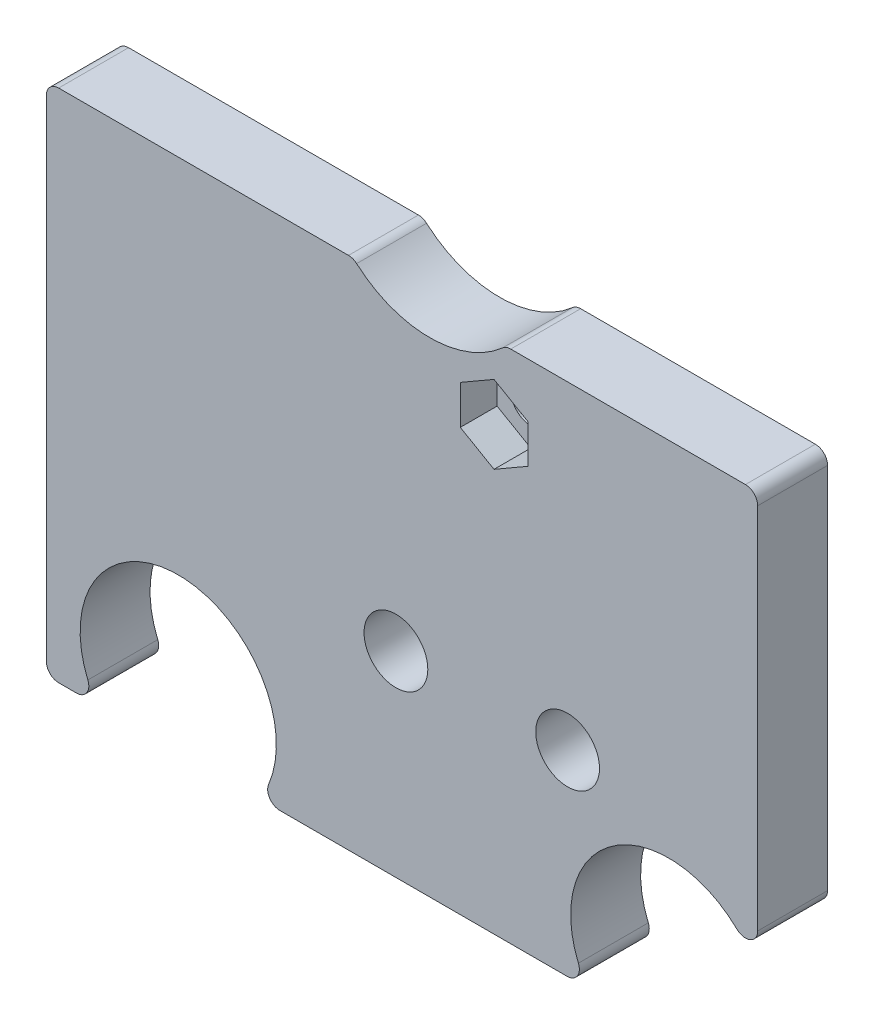
ISO-10303-21;
HEADER;
FILE_DESCRIPTION(('STEP AP214'),'2;1');
FILE_NAME('part.step','',(''),(''),'','','');
FILE_SCHEMA(('AUTOMOTIVE_DESIGN { 1 0 10303 214 1 1 1 1 }'));
ENDSEC;
DATA;
#1=APPLICATION_CONTEXT('core data for automotive mechanical design processes');
#2=APPLICATION_PROTOCOL_DEFINITION('international standard','automotive_design',2000,#1);
#3=PRODUCT_CONTEXT('',#1,'mechanical');
#4=PRODUCT('Part','Part','',(#3));
#5=PRODUCT_RELATED_PRODUCT_CATEGORY('part','',(#4));
#6=PRODUCT_DEFINITION_FORMATION('','',#4);
#7=PRODUCT_DEFINITION_CONTEXT('part definition',#1,'design');
#8=PRODUCT_DEFINITION('design','',#6,#7);
#9=PRODUCT_DEFINITION_SHAPE('','',#8);
#10=(LENGTH_UNIT() NAMED_UNIT(*) SI_UNIT(.MILLI.,.METRE.));
#11=(NAMED_UNIT(*) PLANE_ANGLE_UNIT() SI_UNIT($,.RADIAN.));
#12=(NAMED_UNIT(*) SI_UNIT($,.STERADIAN.) SOLID_ANGLE_UNIT());
#13=UNCERTAINTY_MEASURE_WITH_UNIT(LENGTH_MEASURE(1.E-05),#10,'distance_accuracy_value','');
#14=(GEOMETRIC_REPRESENTATION_CONTEXT(3) GLOBAL_UNCERTAINTY_ASSIGNED_CONTEXT((#13)) GLOBAL_UNIT_ASSIGNED_CONTEXT((#10,
#11,#12)) REPRESENTATION_CONTEXT('',''));
#15=CARTESIAN_POINT('',(0.,0.,0.));
#16=DIRECTION('',(0.,0.,1.));
#17=DIRECTION('',(1.,0.,0.));
#18=AXIS2_PLACEMENT_3D('',#15,#16,#17);
#19=CARTESIAN_POINT('',(26.75,-6.5,5.7));
#20=DIRECTION('',(-1.,0.,0.));
#21=DIRECTION('',(0.,0.,1.));
#22=AXIS2_PLACEMENT_3D('',#19,#20,#21);
#23=PLANE('',#22);
#24=DIRECTION('',(0.,1.,0.));
#25=VECTOR('',#24,1.);
#26=CARTESIAN_POINT('',(26.75,-6.5,0.));
#27=LINE('',#26,#25);
#28=CARTESIAN_POINT('',(26.75,-37.5240830765057,0.));
#29=VERTEX_POINT('',#28);
#30=CARTESIAN_POINT('',(26.75,-7.5,0.));
#31=VERTEX_POINT('',#30);
#32=EDGE_CURVE('E278',#29,#31,#27,.T.);
#33=ORIENTED_EDGE('',*,*,#32,.T.);
#34=DIRECTION('',(0.,0.,-1.));
#35=VECTOR('',#34,1.);
#36=CARTESIAN_POINT('',(26.75,-7.5,5.7));
#37=LINE('',#36,#35);
#38=CARTESIAN_POINT('',(26.75,-7.5,5.7));
#39=VERTEX_POINT('',#38);
#40=EDGE_CURVE('E72',#31,#39,#37,.F.);
#41=ORIENTED_EDGE('',*,*,#40,.T.);
#42=DIRECTION('',(0.,1.,0.));
#43=VECTOR('',#42,1.);
#44=CARTESIAN_POINT('',(26.75,-6.5,5.7));
#45=LINE('',#44,#43);
#46=CARTESIAN_POINT('',(26.75,-37.5240830765057,5.7));
#47=VERTEX_POINT('',#46);
#48=EDGE_CURVE('E343',#47,#39,#45,.T.);
#49=ORIENTED_EDGE('',*,*,#48,.F.);
#50=DIRECTION('',(0.,0.,1.));
#51=VECTOR('',#50,1.);
#52=CARTESIAN_POINT('',(26.75,-37.5240830765057,0.));
#53=LINE('',#52,#51);
#54=EDGE_CURVE('E438',#47,#29,#53,.F.);
#55=ORIENTED_EDGE('',*,*,#54,.T.);
#56=EDGE_LOOP('',(#33,#41,#49,#55));
#57=FACE_BOUND('',#56,.T.);
#58=ADVANCED_FACE('F48',(#57),#23,.F.);
#59=CARTESIAN_POINT('',(-31.25,-6.5,5.7));
#60=DIRECTION('',(0.,-1.,0.));
#61=DIRECTION('',(1.,0.,0.));
#62=AXIS2_PLACEMENT_3D('',#59,#60,#61);
#63=PLANE('',#62);
#64=DIRECTION('',(-1.,0.,0.));
#65=VECTOR('',#64,1.);
#66=CARTESIAN_POINT('',(-31.25,-6.5,5.7));
#67=LINE('',#66,#65);
#68=CARTESIAN_POINT('',(-6.61437827766149,-6.5,5.7));
#69=VERTEX_POINT('',#68);
#70=CARTESIAN_POINT('',(-30.25,-6.5,5.7));
#71=VERTEX_POINT('',#70);
#72=EDGE_CURVE('E312',#69,#71,#67,.T.);
#73=ORIENTED_EDGE('',*,*,#72,.F.);
#74=DIRECTION('',(0.,0.,1.));
#75=VECTOR('',#74,1.);
#76=CARTESIAN_POINT('',(-6.61437827766148,-6.5,0.));
#77=LINE('',#76,#75);
#78=CARTESIAN_POINT('',(-6.61437827766149,-6.5,0.));
#79=VERTEX_POINT('',#78);
#80=EDGE_CURVE('E454',#69,#79,#77,.F.);
#81=ORIENTED_EDGE('',*,*,#80,.T.);
#82=DIRECTION('',(-1.,0.,0.));
#83=VECTOR('',#82,1.);
#84=CARTESIAN_POINT('',(-31.25,-6.5,0.));
#85=LINE('',#84,#83);
#86=CARTESIAN_POINT('',(-30.25,-6.5,0.));
#87=VERTEX_POINT('',#86);
#88=EDGE_CURVE('E302',#79,#87,#85,.T.);
#89=ORIENTED_EDGE('',*,*,#88,.T.);
#90=DIRECTION('',(0.,0.,-1.));
#91=VECTOR('',#90,1.);
#92=CARTESIAN_POINT('',(-30.25,-6.5,5.7));
#93=LINE('',#92,#91);
#94=EDGE_CURVE('E451',#87,#71,#93,.F.);
#95=ORIENTED_EDGE('',*,*,#94,.T.);
#96=EDGE_LOOP('',(#73,#81,#89,#95));
#97=FACE_BOUND('',#96,.T.);
#98=ADVANCED_FACE('F544',(#97),#63,.F.);
#99=CARTESIAN_POINT('',(25.75,-6.5,5.7));
#100=VERTEX_POINT('',#99);
#101=CARTESIAN_POINT('',(6.61437827766147,-6.5,5.7));
#102=VERTEX_POINT('',#101);
#103=EDGE_CURVE('E300',#100,#102,#67,.T.);
#104=ORIENTED_EDGE('',*,*,#103,.F.);
#105=DIRECTION('',(0.,0.,-1.));
#106=VECTOR('',#105,1.);
#107=CARTESIAN_POINT('',(25.75,-6.5,5.7));
#108=LINE('',#107,#106);
#109=CARTESIAN_POINT('',(25.75,-6.5,0.));
#110=VERTEX_POINT('',#109);
#111=EDGE_CURVE('E434',#100,#110,#108,.T.);
#112=ORIENTED_EDGE('',*,*,#111,.T.);
#113=CARTESIAN_POINT('',(6.61437827766147,-6.5,0.));
#114=VERTEX_POINT('',#113);
#115=EDGE_CURVE('E306',#110,#114,#85,.T.);
#116=ORIENTED_EDGE('',*,*,#115,.T.);
#117=DIRECTION('',(0.,0.,1.));
#118=VECTOR('',#117,1.);
#119=CARTESIAN_POINT('',(6.61437827766148,-6.5,5.7));
#120=LINE('',#119,#118);
#121=EDGE_CURVE('E431',#114,#102,#120,.T.);
#122=ORIENTED_EDGE('',*,*,#121,.T.);
#123=EDGE_LOOP('',(#104,#112,#116,#122));
#124=FACE_BOUND('',#123,.T.);
#125=ADVANCED_FACE('F525',(#124),#63,.F.);
#126=CARTESIAN_POINT('',(-31.25,-48.5,5.7));
#127=DIRECTION('',(0.,1.,0.));
#128=DIRECTION('',(0.,0.,1.));
#129=AXIS2_PLACEMENT_3D('',#126,#127,#128);
#130=PLANE('',#129);
#131=DIRECTION('',(1.,0.,0.));
#132=VECTOR('',#131,1.);
#133=CARTESIAN_POINT('',(-31.25,-48.5,0.));
#134=LINE('',#133,#132);
#135=CARTESIAN_POINT('',(-12.2084380241115,-48.5,0.));
#136=VERTEX_POINT('',#135);
#137=CARTESIAN_POINT('',(11.2084380241115,-48.5,0.));
#138=VERTEX_POINT('',#137);
#139=EDGE_CURVE('E355',#136,#138,#134,.T.);
#140=ORIENTED_EDGE('',*,*,#139,.T.);
#141=DIRECTION('',(0.,0.,1.));
#142=VECTOR('',#141,1.);
#143=CARTESIAN_POINT('',(11.2084380241115,-48.5,5.7));
#144=LINE('',#143,#142);
#145=CARTESIAN_POINT('',(11.2084380241115,-48.5,5.7));
#146=VERTEX_POINT('',#145);
#147=EDGE_CURVE('E468',#138,#146,#144,.T.);
#148=ORIENTED_EDGE('',*,*,#147,.T.);
#149=DIRECTION('',(1.,0.,0.));
#150=VECTOR('',#149,1.);
#151=CARTESIAN_POINT('',(-31.25,-48.5,5.7));
#152=LINE('',#151,#150);
#153=CARTESIAN_POINT('',(-12.2084380241115,-48.5,5.7));
#154=VERTEX_POINT('',#153);
#155=EDGE_CURVE('E349',#154,#146,#152,.T.);
#156=ORIENTED_EDGE('',*,*,#155,.F.);
#157=DIRECTION('',(0.,0.,1.));
#158=VECTOR('',#157,1.);
#159=CARTESIAN_POINT('',(-12.2084380241115,-48.5,0.));
#160=LINE('',#159,#158);
#161=EDGE_CURVE('E465',#154,#136,#160,.F.);
#162=ORIENTED_EDGE('',*,*,#161,.T.);
#163=EDGE_LOOP('',(#140,#148,#156,#162));
#164=FACE_BOUND('',#163,.T.);
#165=ADVANCED_FACE('F577',(#164),#130,.F.);
#166=CARTESIAN_POINT('',(-30.25,-48.5,5.7));
#167=VERTEX_POINT('',#166);
#168=CARTESIAN_POINT('',(-28.7915619758885,-48.5,5.7));
#169=VERTEX_POINT('',#168);
#170=EDGE_CURVE('E311',#167,#169,#152,.T.);
#171=ORIENTED_EDGE('',*,*,#170,.F.);
#172=DIRECTION('',(0.,0.,-1.));
#173=VECTOR('',#172,1.);
#174=CARTESIAN_POINT('',(-30.25,-48.5,5.7));
#175=LINE('',#174,#173);
#176=CARTESIAN_POINT('',(-30.25,-48.5,0.));
#177=VERTEX_POINT('',#176);
#178=EDGE_CURVE('E366',#167,#177,#175,.T.);
#179=ORIENTED_EDGE('',*,*,#178,.T.);
#180=CARTESIAN_POINT('',(-28.7915619758885,-48.5,0.));
#181=VERTEX_POINT('',#180);
#182=EDGE_CURVE('E301',#177,#181,#134,.T.);
#183=ORIENTED_EDGE('',*,*,#182,.T.);
#184=DIRECTION('',(0.,0.,1.));
#185=VECTOR('',#184,1.);
#186=CARTESIAN_POINT('',(-28.7915619758885,-48.5,5.7));
#187=LINE('',#186,#185);
#188=EDGE_CURVE('E348',#181,#169,#187,.T.);
#189=ORIENTED_EDGE('',*,*,#188,.T.);
#190=EDGE_LOOP('',(#171,#179,#183,#189));
#191=FACE_BOUND('',#190,.T.);
#192=ADVANCED_FACE('F498',(#191),#130,.F.);
#193=CARTESIAN_POINT('',(-31.25,-6.5,5.7));
#194=DIRECTION('',(1.,0.,0.));
#195=DIRECTION('',(0.,1.,0.));
#196=AXIS2_PLACEMENT_3D('',#193,#194,#195);
#197=PLANE('',#196);
#198=DIRECTION('',(0.,-1.,0.));
#199=VECTOR('',#198,1.);
#200=CARTESIAN_POINT('',(-31.25,-6.5,0.));
#201=LINE('',#200,#199);
#202=CARTESIAN_POINT('',(-31.25,-7.5,0.));
#203=VERTEX_POINT('',#202);
#204=CARTESIAN_POINT('',(-31.25,-47.5,0.));
#205=VERTEX_POINT('',#204);
#206=EDGE_CURVE('E296',#203,#205,#201,.T.);
#207=ORIENTED_EDGE('',*,*,#206,.T.);
#208=DIRECTION('',(0.,0.,-1.));
#209=VECTOR('',#208,1.);
#210=CARTESIAN_POINT('',(-31.25,-47.5,5.7));
#211=LINE('',#210,#209);
#212=CARTESIAN_POINT('',(-31.25,-47.5,5.7));
#213=VERTEX_POINT('',#212);
#214=EDGE_CURVE('E401',#205,#213,#211,.F.);
#215=ORIENTED_EDGE('',*,*,#214,.T.);
#216=DIRECTION('',(0.,-1.,0.));
#217=VECTOR('',#216,1.);
#218=CARTESIAN_POINT('',(-31.25,-6.5,5.7));
#219=LINE('',#218,#217);
#220=CARTESIAN_POINT('',(-31.25,-7.5,5.7));
#221=VERTEX_POINT('',#220);
#222=EDGE_CURVE('E307',#221,#213,#219,.T.);
#223=ORIENTED_EDGE('',*,*,#222,.F.);
#224=DIRECTION('',(0.,0.,-1.));
#225=VECTOR('',#224,1.);
#226=CARTESIAN_POINT('',(-31.25,-7.5,5.7));
#227=LINE('',#226,#225);
#228=EDGE_CURVE('E397',#221,#203,#227,.T.);
#229=ORIENTED_EDGE('',*,*,#228,.T.);
#230=EDGE_LOOP('',(#207,#215,#223,#229));
#231=FACE_BOUND('',#230,.T.);
#232=ADVANCED_FACE('F553',(#231),#197,.F.);
#233=CARTESIAN_POINT('',(0.,0.,5.7));
#234=DIRECTION('',(0.,0.,1.));
#235=DIRECTION('',(1.,0.,0.));
#236=AXIS2_PLACEMENT_3D('',#233,#234,#235);
#237=PLANE('',#236);
#238=DIRECTION('',(0.,-1.,0.));
#239=VECTOR('',#238,1.);
#240=CARTESIAN_POINT('',(2.49999999999967,-10.9122867597282,5.7));
#241=LINE('',#240,#239);
#242=CARTESIAN_POINT('',(2.49999999999967,-10.9122867597282,5.7));
#243=VERTEX_POINT('',#242);
#244=CARTESIAN_POINT('',(2.49999999999967,-14.0877132402712,5.7));
#245=VERTEX_POINT('',#244);
#246=EDGE_CURVE('E64',#243,#245,#241,.T.);
#247=ORIENTED_EDGE('',*,*,#246,.F.);
#248=DIRECTION('',(-0.866025403784439,-0.5,0.));
#249=VECTOR('',#248,1.);
#250=CARTESIAN_POINT('',(5.24999999999967,-9.32457351945674,5.7));
#251=LINE('',#250,#249);
#252=CARTESIAN_POINT('',(5.24999999999967,-9.32457351945674,5.7));
#253=VERTEX_POINT('',#252);
#254=EDGE_CURVE('E236',#253,#243,#251,.T.);
#255=ORIENTED_EDGE('',*,*,#254,.F.);
#256=DIRECTION('',(-0.866025403784439,0.5,0.));
#257=VECTOR('',#256,1.);
#258=CARTESIAN_POINT('',(7.99999999999967,-10.9122867597282,5.7));
#259=LINE('',#258,#257);
#260=CARTESIAN_POINT('',(7.99999999999967,-10.9122867597282,5.7));
#261=VERTEX_POINT('',#260);
#262=EDGE_CURVE('E241',#261,#253,#259,.T.);
#263=ORIENTED_EDGE('',*,*,#262,.F.);
#264=DIRECTION('',(0.,1.,0.));
#265=VECTOR('',#264,1.);
#266=CARTESIAN_POINT('',(7.99999999999967,-14.0877132402712,5.7));
#267=LINE('',#266,#265);
#268=CARTESIAN_POINT('',(7.99999999999967,-14.0877132402712,5.7));
#269=VERTEX_POINT('',#268);
#270=EDGE_CURVE('E268',#269,#261,#267,.T.);
#271=ORIENTED_EDGE('',*,*,#270,.F.);
#272=DIRECTION('',(0.866025403784438,0.500000000000001,0.));
#273=VECTOR('',#272,1.);
#274=CARTESIAN_POINT('',(5.24999999999967,-15.6754264805426,5.7));
#275=LINE('',#274,#273);
#276=CARTESIAN_POINT('',(5.24999999999967,-15.6754264805426,5.7));
#277=VERTEX_POINT('',#276);
#278=EDGE_CURVE('E264',#277,#269,#275,.T.);
#279=ORIENTED_EDGE('',*,*,#278,.F.);
#280=DIRECTION('',(0.866025403784438,-0.500000000000001,0.));
#281=VECTOR('',#280,1.);
#282=CARTESIAN_POINT('',(2.49999999999967,-14.0877132402712,5.7));
#283=LINE('',#282,#281);
#284=EDGE_CURVE('E260',#245,#277,#283,.T.);
#285=ORIENTED_EDGE('',*,*,#284,.F.);
#286=EDGE_LOOP('',(#247,#255,#263,#271,#279,#285));
#287=FACE_BOUND('',#286,.T.);
#288=CARTESIAN_POINT('',(11.25,-32.5,5.7));
#289=DIRECTION('',(0.,0.,1.));
#290=DIRECTION('',(1.,0.,0.));
#291=AXIS2_PLACEMENT_3D('',#288,#289,#290);
#292=CIRCLE('',#291,2.6);
#293=CARTESIAN_POINT('',(13.85,-32.5,5.7));
#294=VERTEX_POINT('',#293);
#295=EDGE_CURVE('E320',#294,#294,#292,.T.);
#296=ORIENTED_EDGE('',*,*,#295,.F.);
#297=EDGE_LOOP('',(#296));
#298=FACE_BOUND('',#297,.T.);
#299=CARTESIAN_POINT('',(-2.74999999999999,-32.5,5.7));
#300=DIRECTION('',(0.,0.,1.));
#301=DIRECTION('',(1.,0.,0.));
#302=AXIS2_PLACEMENT_3D('',#299,#300,#301);
#303=CIRCLE('',#302,2.6);
#304=CARTESIAN_POINT('',(-0.149999999999996,-32.5,5.7));
#305=VERTEX_POINT('',#304);
#306=EDGE_CURVE('E316',#305,#305,#303,.T.);
#307=ORIENTED_EDGE('',*,*,#306,.F.);
#308=EDGE_LOOP('',(#307));
#309=FACE_BOUND('',#308,.T.);
#310=ORIENTED_EDGE('',*,*,#222,.T.);
#311=CARTESIAN_POINT('',(-30.25,-47.5,5.7));
#312=DIRECTION('',(0.,0.,1.));
#313=DIRECTION('',(1.,0.,0.));
#314=AXIS2_PLACEMENT_3D('',#311,#312,#313);
#315=CIRCLE('',#314,1.);
#316=EDGE_CURVE('E428',#213,#167,#315,.T.);
#317=ORIENTED_EDGE('',*,*,#316,.T.);
#318=ORIENTED_EDGE('',*,*,#170,.T.);
#319=CARTESIAN_POINT('',(-28.7915619758885,-47.5,5.7));
#320=DIRECTION('',(0.,0.,1.));
#321=DIRECTION('',(1.,0.,0.));
#322=AXIS2_PLACEMENT_3D('',#319,#320,#321);
#323=CIRCLE('',#322,1.);
#324=CARTESIAN_POINT('',(-27.8702773119009,-47.1111111111111,5.7));
#325=VERTEX_POINT('',#324);
#326=EDGE_CURVE('E404',#169,#325,#323,.T.);
#327=ORIENTED_EDGE('',*,*,#326,.T.);
#328=CARTESIAN_POINT('',(-20.5,-44.,5.7));
#329=DIRECTION('',(0.,0.,1.));
#330=DIRECTION('',(1.,0.,0.));
#331=AXIS2_PLACEMENT_3D('',#328,#329,#330);
#332=CIRCLE('',#331,8.);
#333=CARTESIAN_POINT('',(-13.1297226880991,-47.1111111111111,5.7));
#334=VERTEX_POINT('',#333);
#335=EDGE_CURVE('E295',#334,#325,#332,.T.);
#336=ORIENTED_EDGE('',*,*,#335,.F.);
#337=CARTESIAN_POINT('',(-12.2084380241115,-47.5,5.7));
#338=DIRECTION('',(0.,0.,1.));
#339=DIRECTION('',(1.,0.,0.));
#340=AXIS2_PLACEMENT_3D('',#337,#338,#339);
#341=CIRCLE('',#340,1.);
#342=EDGE_CURVE('E410',#334,#154,#341,.T.);
#343=ORIENTED_EDGE('',*,*,#342,.T.);
#344=ORIENTED_EDGE('',*,*,#155,.T.);
#345=CARTESIAN_POINT('',(11.2084380241115,-47.5,5.7));
#346=DIRECTION('',(0.,0.,1.));
#347=DIRECTION('',(1.,0.,0.));
#348=AXIS2_PLACEMENT_3D('',#345,#346,#347);
#349=CIRCLE('',#348,1.);
#350=CARTESIAN_POINT('',(12.1297226880991,-47.1111111111111,5.7));
#351=VERTEX_POINT('',#350);
#352=EDGE_CURVE('E413',#146,#351,#349,.T.);
#353=ORIENTED_EDGE('',*,*,#352,.T.);
#354=CARTESIAN_POINT('',(19.5,-44.,5.7));
#355=DIRECTION('',(0.,0.,1.));
#356=DIRECTION('',(1.,0.,0.));
#357=AXIS2_PLACEMENT_3D('',#354,#355,#356);
#358=CIRCLE('',#357,8.);
#359=CARTESIAN_POINT('',(25.0555555555556,-38.2436294013384,5.7));
#360=VERTEX_POINT('',#359);
#361=EDGE_CURVE('E294',#360,#351,#358,.T.);
#362=ORIENTED_EDGE('',*,*,#361,.F.);
#363=CARTESIAN_POINT('',(25.75,-37.5240830765057,5.7));
#364=DIRECTION('',(0.,0.,1.));
#365=DIRECTION('',(1.,0.,0.));
#366=AXIS2_PLACEMENT_3D('',#363,#364,#365);
#367=CIRCLE('',#366,1.);
#368=EDGE_CURVE('E416',#360,#47,#367,.T.);
#369=ORIENTED_EDGE('',*,*,#368,.T.);
#370=ORIENTED_EDGE('',*,*,#48,.T.);
#371=CARTESIAN_POINT('',(25.75,-7.5,5.7));
#372=DIRECTION('',(0.,0.,1.));
#373=DIRECTION('',(1.,0.,0.));
#374=AXIS2_PLACEMENT_3D('',#371,#372,#373);
#375=CIRCLE('',#374,1.);
#376=EDGE_CURVE('E425',#39,#100,#375,.T.);
#377=ORIENTED_EDGE('',*,*,#376,.T.);
#378=ORIENTED_EDGE('',*,*,#103,.T.);
#379=CARTESIAN_POINT('',(6.61437827766148,-7.5,5.7));
#380=DIRECTION('',(0.,0.,1.));
#381=DIRECTION('',(1.,0.,0.));
#382=AXIS2_PLACEMENT_3D('',#379,#380,#381);
#383=CIRCLE('',#382,1.);
#384=CARTESIAN_POINT('',(5.95294044989533,-6.75,5.7));
#385=VERTEX_POINT('',#384);
#386=EDGE_CURVE('E422',#102,#385,#383,.T.);
#387=ORIENTED_EDGE('',*,*,#386,.T.);
#388=CARTESIAN_POINT('',(0.,0.,5.7));
#389=DIRECTION('',(0.,0.,1.));
#390=DIRECTION('',(1.,0.,0.));
#391=AXIS2_PLACEMENT_3D('',#388,#389,#390);
#392=CIRCLE('',#391,9.);
#393=CARTESIAN_POINT('',(-5.95294044989533,-6.75,5.7));
#394=VERTEX_POINT('',#393);
#395=EDGE_CURVE('E344',#394,#385,#392,.T.);
#396=ORIENTED_EDGE('',*,*,#395,.F.);
#397=CARTESIAN_POINT('',(-6.61437827766148,-7.5,5.7));
#398=DIRECTION('',(0.,0.,1.));
#399=DIRECTION('',(1.,0.,0.));
#400=AXIS2_PLACEMENT_3D('',#397,#398,#399);
#401=CIRCLE('',#400,1.);
#402=EDGE_CURVE('E419',#394,#69,#401,.T.);
#403=ORIENTED_EDGE('',*,*,#402,.T.);
#404=ORIENTED_EDGE('',*,*,#72,.T.);
#405=CARTESIAN_POINT('',(-30.25,-7.5,5.7));
#406=DIRECTION('',(0.,0.,1.));
#407=DIRECTION('',(1.,0.,0.));
#408=AXIS2_PLACEMENT_3D('',#405,#406,#407);
#409=CIRCLE('',#408,1.);
#410=EDGE_CURVE('E407',#71,#221,#409,.T.);
#411=ORIENTED_EDGE('',*,*,#410,.T.);
#412=EDGE_LOOP('',(#310,#317,#318,#327,#336,#343,#344,#353,#362,#369,#370,#377,#378,#387,#396,
#403,#404,#411));
#413=FACE_BOUND('',#412,.T.);
#414=ADVANCED_FACE('F492',(#287,#298,#309,#413),#237,.T.);
#415=CARTESIAN_POINT('',(0.,0.,0.));
#416=DIRECTION('',(0.,0.,1.));
#417=DIRECTION('',(1.,0.,0.));
#418=AXIS2_PLACEMENT_3D('',#415,#416,#417);
#419=PLANE('',#418);
#420=CARTESIAN_POINT('',(5.24999999999967,-12.4999999999997,0.));
#421=DIRECTION('',(0.,0.,1.));
#422=DIRECTION('',(1.,0.,0.));
#423=AXIS2_PLACEMENT_3D('',#420,#421,#422);
#424=CIRCLE('',#423,1.6);
#425=CARTESIAN_POINT('',(6.84999999999967,-12.4999999999997,0.));
#426=VERTEX_POINT('',#425);
#427=EDGE_CURVE('E261',#426,#426,#424,.T.);
#428=ORIENTED_EDGE('',*,*,#427,.T.);
#429=EDGE_LOOP('',(#428));
#430=FACE_BOUND('',#429,.T.);
#431=ORIENTED_EDGE('',*,*,#182,.F.);
#432=CARTESIAN_POINT('',(-30.25,-47.5,0.));
#433=DIRECTION('',(0.,0.,1.));
#434=DIRECTION('',(1.,0.,0.));
#435=AXIS2_PLACEMENT_3D('',#432,#433,#434);
#436=CIRCLE('',#435,1.);
#437=EDGE_CURVE('E394',#177,#205,#436,.F.);
#438=ORIENTED_EDGE('',*,*,#437,.T.);
#439=ORIENTED_EDGE('',*,*,#206,.F.);
#440=CARTESIAN_POINT('',(-30.25,-7.5,0.));
#441=DIRECTION('',(0.,0.,1.));
#442=DIRECTION('',(1.,0.,0.));
#443=AXIS2_PLACEMENT_3D('',#440,#441,#442);
#444=CIRCLE('',#443,1.);
#445=EDGE_CURVE('E373',#203,#87,#444,.F.);
#446=ORIENTED_EDGE('',*,*,#445,.T.);
#447=ORIENTED_EDGE('',*,*,#88,.F.);
#448=CARTESIAN_POINT('',(-6.61437827766148,-7.5,0.));
#449=DIRECTION('',(0.,0.,1.));
#450=DIRECTION('',(1.,0.,0.));
#451=AXIS2_PLACEMENT_3D('',#448,#449,#450);
#452=CIRCLE('',#451,1.);
#453=CARTESIAN_POINT('',(-5.95294044989533,-6.75,0.));
#454=VERTEX_POINT('',#453);
#455=EDGE_CURVE('E385',#79,#454,#452,.F.);
#456=ORIENTED_EDGE('',*,*,#455,.T.);
#457=CARTESIAN_POINT('',(0.,0.,0.));
#458=DIRECTION('',(0.,0.,1.));
#459=DIRECTION('',(1.,0.,0.));
#460=AXIS2_PLACEMENT_3D('',#457,#458,#459);
#461=CIRCLE('',#460,9.);
#462=CARTESIAN_POINT('',(5.95294044989533,-6.75,0.));
#463=VERTEX_POINT('',#462);
#464=EDGE_CURVE('E339',#454,#463,#461,.T.);
#465=ORIENTED_EDGE('',*,*,#464,.T.);
#466=CARTESIAN_POINT('',(6.61437827766148,-7.5,0.));
#467=DIRECTION('',(0.,0.,1.));
#468=DIRECTION('',(1.,0.,0.));
#469=AXIS2_PLACEMENT_3D('',#466,#467,#468);
#470=CIRCLE('',#469,1.);
#471=EDGE_CURVE('E388',#463,#114,#470,.F.);
#472=ORIENTED_EDGE('',*,*,#471,.T.);
#473=ORIENTED_EDGE('',*,*,#115,.F.);
#474=CARTESIAN_POINT('',(25.75,-7.5,0.));
#475=DIRECTION('',(0.,0.,1.));
#476=DIRECTION('',(1.,0.,0.));
#477=AXIS2_PLACEMENT_3D('',#474,#475,#476);
#478=CIRCLE('',#477,1.);
#479=EDGE_CURVE('E391',#110,#31,#478,.F.);
#480=ORIENTED_EDGE('',*,*,#479,.T.);
#481=ORIENTED_EDGE('',*,*,#32,.F.);
#482=CARTESIAN_POINT('',(25.75,-37.5240830765057,0.));
#483=DIRECTION('',(0.,0.,1.));
#484=DIRECTION('',(1.,0.,0.));
#485=AXIS2_PLACEMENT_3D('',#482,#483,#484);
#486=CIRCLE('',#485,1.);
#487=CARTESIAN_POINT('',(25.0555555555556,-38.2436294013384,0.));
#488=VERTEX_POINT('',#487);
#489=EDGE_CURVE('E382',#29,#488,#486,.F.);
#490=ORIENTED_EDGE('',*,*,#489,.T.);
#491=CARTESIAN_POINT('',(19.5,-44.,0.));
#492=DIRECTION('',(0.,0.,1.));
#493=DIRECTION('',(1.,0.,0.));
#494=AXIS2_PLACEMENT_3D('',#491,#492,#493);
#495=CIRCLE('',#494,8.);
#496=CARTESIAN_POINT('',(12.1297226880991,-47.1111111111111,0.));
#497=VERTEX_POINT('',#496);
#498=EDGE_CURVE('E332',#488,#497,#495,.T.);
#499=ORIENTED_EDGE('',*,*,#498,.T.);
#500=CARTESIAN_POINT('',(11.2084380241115,-47.5,0.));
#501=DIRECTION('',(0.,0.,1.));
#502=DIRECTION('',(1.,0.,0.));
#503=AXIS2_PLACEMENT_3D('',#500,#501,#502);
#504=CIRCLE('',#503,1.);
#505=EDGE_CURVE('E379',#497,#138,#504,.F.);
#506=ORIENTED_EDGE('',*,*,#505,.T.);
#507=ORIENTED_EDGE('',*,*,#139,.F.);
#508=CARTESIAN_POINT('',(-12.2084380241115,-47.5,0.));
#509=DIRECTION('',(0.,0.,1.));
#510=DIRECTION('',(1.,0.,0.));
#511=AXIS2_PLACEMENT_3D('',#508,#509,#510);
#512=CIRCLE('',#511,1.);
#513=CARTESIAN_POINT('',(-13.1297226880991,-47.1111111111111,0.));
#514=VERTEX_POINT('',#513);
#515=EDGE_CURVE('E376',#136,#514,#512,.F.);
#516=ORIENTED_EDGE('',*,*,#515,.T.);
#517=CARTESIAN_POINT('',(-20.5,-44.,0.));
#518=DIRECTION('',(0.,0.,1.));
#519=DIRECTION('',(1.,0.,0.));
#520=AXIS2_PLACEMENT_3D('',#517,#518,#519);
#521=CIRCLE('',#520,8.);
#522=CARTESIAN_POINT('',(-27.8702773119009,-47.1111111111111,0.));
#523=VERTEX_POINT('',#522);
#524=EDGE_CURVE('E290',#523,#514,#521,.F.);
#525=ORIENTED_EDGE('',*,*,#524,.F.);
#526=CARTESIAN_POINT('',(-28.7915619758885,-47.5,0.));
#527=DIRECTION('',(0.,0.,1.));
#528=DIRECTION('',(1.,0.,0.));
#529=AXIS2_PLACEMENT_3D('',#526,#527,#528);
#530=CIRCLE('',#529,1.);
#531=EDGE_CURVE('E370',#523,#181,#530,.F.);
#532=ORIENTED_EDGE('',*,*,#531,.T.);
#533=EDGE_LOOP('',(#431,#438,#439,#446,#447,#456,#465,#472,#473,#480,#481,#490,#499,#506,#507,
#516,#525,#532));
#534=FACE_BOUND('',#533,.T.);
#535=CARTESIAN_POINT('',(11.25,-32.5,0.));
#536=DIRECTION('',(0.,0.,1.));
#537=DIRECTION('',(1.,0.,0.));
#538=AXIS2_PLACEMENT_3D('',#535,#536,#537);
#539=CIRCLE('',#538,2.6);
#540=CARTESIAN_POINT('',(13.85,-32.5,0.));
#541=VERTEX_POINT('',#540);
#542=EDGE_CURVE('E325',#541,#541,#539,.T.);
#543=ORIENTED_EDGE('',*,*,#542,.T.);
#544=EDGE_LOOP('',(#543));
#545=FACE_BOUND('',#544,.T.);
#546=CARTESIAN_POINT('',(-2.74999999999999,-32.5,0.));
#547=DIRECTION('',(0.,0.,1.));
#548=DIRECTION('',(1.,0.,0.));
#549=AXIS2_PLACEMENT_3D('',#546,#547,#548);
#550=CIRCLE('',#549,2.6);
#551=CARTESIAN_POINT('',(-0.149999999999996,-32.5,0.));
#552=VERTEX_POINT('',#551);
#553=EDGE_CURVE('E321',#552,#552,#550,.T.);
#554=ORIENTED_EDGE('',*,*,#553,.T.);
#555=EDGE_LOOP('',(#554));
#556=FACE_BOUND('',#555,.T.);
#557=ADVANCED_FACE('F483',(#430,#534,#545,#556),#419,.F.);
#558=CARTESIAN_POINT('',(-2.74999999999999,-32.5,5.7));
#559=DIRECTION('',(0.,0.,-1.));
#560=DIRECTION('',(-1.,0.,0.));
#561=AXIS2_PLACEMENT_3D('',#558,#559,#560);
#562=CYLINDRICAL_SURFACE('',#561,2.6);
#563=ORIENTED_EDGE('',*,*,#306,.T.);
#564=EDGE_LOOP('',(#563));
#565=FACE_BOUND('',#564,.T.);
#566=ORIENTED_EDGE('',*,*,#553,.F.);
#567=EDGE_LOOP('',(#566));
#568=FACE_BOUND('',#567,.T.);
#569=ADVANCED_FACE('F664',(#565,#568),#562,.F.);
#570=CARTESIAN_POINT('',(11.25,-32.5,5.7));
#571=DIRECTION('',(0.,0.,-1.));
#572=DIRECTION('',(-1.,0.,0.));
#573=AXIS2_PLACEMENT_3D('',#570,#571,#572);
#574=CYLINDRICAL_SURFACE('',#573,2.6);
#575=ORIENTED_EDGE('',*,*,#295,.T.);
#576=EDGE_LOOP('',(#575));
#577=FACE_BOUND('',#576,.T.);
#578=ORIENTED_EDGE('',*,*,#542,.F.);
#579=EDGE_LOOP('',(#578));
#580=FACE_BOUND('',#579,.T.);
#581=ADVANCED_FACE('F584',(#577,#580),#574,.F.);
#582=CARTESIAN_POINT('',(-20.5,-44.,5.7));
#583=DIRECTION('',(0.,0.,-1.));
#584=DIRECTION('',(-1.,0.,0.));
#585=AXIS2_PLACEMENT_3D('',#582,#583,#584);
#586=CYLINDRICAL_SURFACE('',#585,8.);
#587=ORIENTED_EDGE('',*,*,#524,.T.);
#588=DIRECTION('',(0.,0.,-1.));
#589=VECTOR('',#588,1.);
#590=CARTESIAN_POINT('',(-13.1297226880991,-47.1111111111111,5.7));
#591=LINE('',#590,#589);
#592=EDGE_CURVE('E11',#514,#334,#591,.F.);
#593=ORIENTED_EDGE('',*,*,#592,.T.);
#594=ORIENTED_EDGE('',*,*,#335,.T.);
#595=DIRECTION('',(0.,0.,-1.));
#596=VECTOR('',#595,1.);
#597=CARTESIAN_POINT('',(-27.8702773119009,-47.1111111111111,5.7));
#598=LINE('',#597,#596);
#599=EDGE_CURVE('E57',#325,#523,#598,.T.);
#600=ORIENTED_EDGE('',*,*,#599,.T.);
#601=EDGE_LOOP('',(#587,#593,#594,#600));
#602=FACE_BOUND('',#601,.T.);
#603=ADVANCED_FACE('F476',(#602),#586,.F.);
#604=CARTESIAN_POINT('',(19.5,-44.,5.7));
#605=DIRECTION('',(0.,0.,-1.));
#606=DIRECTION('',(-1.,0.,0.));
#607=AXIS2_PLACEMENT_3D('',#604,#605,#606);
#608=CYLINDRICAL_SURFACE('',#607,8.);
#609=ORIENTED_EDGE('',*,*,#498,.F.);
#610=DIRECTION('',(0.,0.,-1.));
#611=VECTOR('',#610,1.);
#612=CARTESIAN_POINT('',(25.0555555555556,-38.2436294013384,5.7));
#613=LINE('',#612,#611);
#614=EDGE_CURVE('E461',#488,#360,#613,.F.);
#615=ORIENTED_EDGE('',*,*,#614,.T.);
#616=ORIENTED_EDGE('',*,*,#361,.T.);
#617=DIRECTION('',(0.,0.,-1.));
#618=VECTOR('',#617,1.);
#619=CARTESIAN_POINT('',(12.1297226880991,-47.1111111111111,5.7));
#620=LINE('',#619,#618);
#621=EDGE_CURVE('E457',#351,#497,#620,.T.);
#622=ORIENTED_EDGE('',*,*,#621,.T.);
#623=EDGE_LOOP('',(#609,#615,#616,#622));
#624=FACE_BOUND('',#623,.T.);
#625=ADVANCED_FACE('F567',(#624),#608,.F.);
#626=CARTESIAN_POINT('',(0.,0.,5.7));
#627=DIRECTION('',(0.,0.,-1.));
#628=DIRECTION('',(-1.,0.,0.));
#629=AXIS2_PLACEMENT_3D('',#626,#627,#628);
#630=CYLINDRICAL_SURFACE('',#629,9.);
#631=ORIENTED_EDGE('',*,*,#395,.T.);
#632=DIRECTION('',(0.,0.,-1.));
#633=VECTOR('',#632,1.);
#634=CARTESIAN_POINT('',(5.95294044989533,-6.75,5.7));
#635=LINE('',#634,#633);
#636=EDGE_CURVE('E447',#385,#463,#635,.T.);
#637=ORIENTED_EDGE('',*,*,#636,.T.);
#638=ORIENTED_EDGE('',*,*,#464,.F.);
#639=DIRECTION('',(0.,0.,-1.));
#640=VECTOR('',#639,1.);
#641=CARTESIAN_POINT('',(-5.95294044989533,-6.75,5.7));
#642=LINE('',#641,#640);
#643=EDGE_CURVE('E443',#454,#394,#642,.F.);
#644=ORIENTED_EDGE('',*,*,#643,.T.);
#645=EDGE_LOOP('',(#631,#637,#638,#644));
#646=FACE_BOUND('',#645,.T.);
#647=ADVANCED_FACE('F534',(#646),#630,.F.);
#648=CARTESIAN_POINT('',(-30.25,-47.5,5.7));
#649=DIRECTION('',(0.,0.,-1.));
#650=DIRECTION('',(-1.,0.,0.));
#651=AXIS2_PLACEMENT_3D('',#648,#649,#650);
#652=CYLINDRICAL_SURFACE('',#651,1.);
#653=ORIENTED_EDGE('',*,*,#316,.F.);
#654=ORIENTED_EDGE('',*,*,#214,.F.);
#655=ORIENTED_EDGE('',*,*,#437,.F.);
#656=ORIENTED_EDGE('',*,*,#178,.F.);
#657=EDGE_LOOP('',(#653,#654,#655,#656));
#658=FACE_BOUND('',#657,.T.);
#659=ADVANCED_FACE('F557',(#658),#652,.T.);
#660=CARTESIAN_POINT('',(25.75,-7.5,5.7));
#661=DIRECTION('',(0.,0.,-1.));
#662=DIRECTION('',(-1.,0.,0.));
#663=AXIS2_PLACEMENT_3D('',#660,#661,#662);
#664=CYLINDRICAL_SURFACE('',#663,1.);
#665=ORIENTED_EDGE('',*,*,#376,.F.);
#666=ORIENTED_EDGE('',*,*,#40,.F.);
#667=ORIENTED_EDGE('',*,*,#479,.F.);
#668=ORIENTED_EDGE('',*,*,#111,.F.);
#669=EDGE_LOOP('',(#665,#666,#667,#668));
#670=FACE_BOUND('',#669,.T.);
#671=ADVANCED_FACE('F559',(#670),#664,.T.);
#672=CARTESIAN_POINT('',(6.61437827766148,-7.5,5.7));
#673=DIRECTION('',(0.,0.,-1.));
#674=DIRECTION('',(-1.,0.,0.));
#675=AXIS2_PLACEMENT_3D('',#672,#673,#674);
#676=CYLINDRICAL_SURFACE('',#675,1.);
#677=ORIENTED_EDGE('',*,*,#386,.F.);
#678=ORIENTED_EDGE('',*,*,#121,.F.);
#679=ORIENTED_EDGE('',*,*,#471,.F.);
#680=ORIENTED_EDGE('',*,*,#636,.F.);
#681=EDGE_LOOP('',(#677,#678,#679,#680));
#682=FACE_BOUND('',#681,.T.);
#683=ADVANCED_FACE('F530',(#682),#676,.T.);
#684=CARTESIAN_POINT('',(-6.61437827766148,-7.5,5.7));
#685=DIRECTION('',(0.,0.,-1.));
#686=DIRECTION('',(-1.,0.,0.));
#687=AXIS2_PLACEMENT_3D('',#684,#685,#686);
#688=CYLINDRICAL_SURFACE('',#687,1.);
#689=ORIENTED_EDGE('',*,*,#455,.F.);
#690=ORIENTED_EDGE('',*,*,#80,.F.);
#691=ORIENTED_EDGE('',*,*,#402,.F.);
#692=ORIENTED_EDGE('',*,*,#643,.F.);
#693=EDGE_LOOP('',(#689,#690,#691,#692));
#694=FACE_BOUND('',#693,.T.);
#695=ADVANCED_FACE('F539',(#694),#688,.T.);
#696=CARTESIAN_POINT('',(25.75,-37.5240830765057,5.7));
#697=DIRECTION('',(0.,0.,-1.));
#698=DIRECTION('',(-1.,0.,0.));
#699=AXIS2_PLACEMENT_3D('',#696,#697,#698);
#700=CYLINDRICAL_SURFACE('',#699,1.);
#701=ORIENTED_EDGE('',*,*,#489,.F.);
#702=ORIENTED_EDGE('',*,*,#54,.F.);
#703=ORIENTED_EDGE('',*,*,#368,.F.);
#704=ORIENTED_EDGE('',*,*,#614,.F.);
#705=EDGE_LOOP('',(#701,#702,#703,#704));
#706=FACE_BOUND('',#705,.T.);
#707=ADVANCED_FACE('F592',(#706),#700,.T.);
#708=CARTESIAN_POINT('',(11.2084380241115,-47.5,5.7));
#709=DIRECTION('',(0.,0.,-1.));
#710=DIRECTION('',(-1.,0.,0.));
#711=AXIS2_PLACEMENT_3D('',#708,#709,#710);
#712=CYLINDRICAL_SURFACE('',#711,1.);
#713=ORIENTED_EDGE('',*,*,#352,.F.);
#714=ORIENTED_EDGE('',*,*,#147,.F.);
#715=ORIENTED_EDGE('',*,*,#505,.F.);
#716=ORIENTED_EDGE('',*,*,#621,.F.);
#717=EDGE_LOOP('',(#713,#714,#715,#716));
#718=FACE_BOUND('',#717,.T.);
#719=ADVANCED_FACE('F649',(#718),#712,.T.);
#720=CARTESIAN_POINT('',(-12.2084380241115,-47.5,5.7));
#721=DIRECTION('',(0.,0.,-1.));
#722=DIRECTION('',(-1.,0.,0.));
#723=AXIS2_PLACEMENT_3D('',#720,#721,#722);
#724=CYLINDRICAL_SURFACE('',#723,1.);
#725=ORIENTED_EDGE('',*,*,#515,.F.);
#726=ORIENTED_EDGE('',*,*,#161,.F.);
#727=ORIENTED_EDGE('',*,*,#342,.F.);
#728=ORIENTED_EDGE('',*,*,#592,.F.);
#729=EDGE_LOOP('',(#725,#726,#727,#728));
#730=FACE_BOUND('',#729,.T.);
#731=ADVANCED_FACE('F490',(#730),#724,.T.);
#732=CARTESIAN_POINT('',(-30.25,-7.5,5.7));
#733=DIRECTION('',(0.,0.,-1.));
#734=DIRECTION('',(-1.,0.,0.));
#735=AXIS2_PLACEMENT_3D('',#732,#733,#734);
#736=CYLINDRICAL_SURFACE('',#735,1.);
#737=ORIENTED_EDGE('',*,*,#410,.F.);
#738=ORIENTED_EDGE('',*,*,#94,.F.);
#739=ORIENTED_EDGE('',*,*,#445,.F.);
#740=ORIENTED_EDGE('',*,*,#228,.F.);
#741=EDGE_LOOP('',(#737,#738,#739,#740));
#742=FACE_BOUND('',#741,.T.);
#743=ADVANCED_FACE('F548',(#742),#736,.T.);
#744=CARTESIAN_POINT('',(-28.7915619758885,-47.5,5.7));
#745=DIRECTION('',(0.,0.,-1.));
#746=DIRECTION('',(-1.,0.,0.));
#747=AXIS2_PLACEMENT_3D('',#744,#745,#746);
#748=CYLINDRICAL_SURFACE('',#747,1.);
#749=ORIENTED_EDGE('',*,*,#326,.F.);
#750=ORIENTED_EDGE('',*,*,#188,.F.);
#751=ORIENTED_EDGE('',*,*,#531,.F.);
#752=ORIENTED_EDGE('',*,*,#599,.F.);
#753=EDGE_LOOP('',(#749,#750,#751,#752));
#754=FACE_BOUND('',#753,.T.);
#755=ADVANCED_FACE('F50',(#754),#748,.T.);
#756=CARTESIAN_POINT('',(2.49999999999967,-10.9122867597282,2.7));
#757=DIRECTION('',(-1.,0.,0.));
#758=DIRECTION('',(0.,0.,1.));
#759=AXIS2_PLACEMENT_3D('',#756,#757,#758);
#760=PLANE('',#759);
#761=ORIENTED_EDGE('',*,*,#246,.T.);
#762=DIRECTION('',(0.,0.,1.));
#763=VECTOR('',#762,1.);
#764=CARTESIAN_POINT('',(2.49999999999967,-14.0877132402712,2.7));
#765=LINE('',#764,#763);
#766=CARTESIAN_POINT('',(2.49999999999967,-14.0877132402712,2.7));
#767=VERTEX_POINT('',#766);
#768=EDGE_CURVE('E210',#767,#245,#765,.T.);
#769=ORIENTED_EDGE('',*,*,#768,.F.);
#770=DIRECTION('',(0.,-1.,0.));
#771=VECTOR('',#770,1.);
#772=CARTESIAN_POINT('',(2.49999999999967,-10.9122867597282,2.7));
#773=LINE('',#772,#771);
#774=CARTESIAN_POINT('',(2.49999999999967,-10.9122867597282,2.7));
#775=VERTEX_POINT('',#774);
#776=EDGE_CURVE('E214',#775,#767,#773,.T.);
#777=ORIENTED_EDGE('',*,*,#776,.F.);
#778=DIRECTION('',(0.,0.,1.));
#779=VECTOR('',#778,1.);
#780=CARTESIAN_POINT('',(2.49999999999967,-10.9122867597282,2.7));
#781=LINE('',#780,#779);
#782=EDGE_CURVE('E275',#775,#243,#781,.T.);
#783=ORIENTED_EDGE('',*,*,#782,.T.);
#784=EDGE_LOOP('',(#761,#769,#777,#783));
#785=FACE_BOUND('',#784,.T.);
#786=ADVANCED_FACE('F212',(#785),#760,.F.);
#787=CARTESIAN_POINT('',(5.24999999999967,-9.32457351945674,2.7));
#788=DIRECTION('',(-0.5,0.866025403784439,0.));
#789=DIRECTION('',(-0.866025403784439,-0.5,0.));
#790=AXIS2_PLACEMENT_3D('',#787,#788,#789);
#791=PLANE('',#790);
#792=ORIENTED_EDGE('',*,*,#254,.T.);
#793=ORIENTED_EDGE('',*,*,#782,.F.);
#794=DIRECTION('',(-0.866025403784439,-0.5,0.));
#795=VECTOR('',#794,1.);
#796=CARTESIAN_POINT('',(5.24999999999967,-9.32457351945674,2.7));
#797=LINE('',#796,#795);
#798=CARTESIAN_POINT('',(5.24999999999967,-9.32457351945674,2.7));
#799=VERTEX_POINT('',#798);
#800=EDGE_CURVE('E221',#799,#775,#797,.T.);
#801=ORIENTED_EDGE('',*,*,#800,.F.);
#802=DIRECTION('',(0.,0.,1.));
#803=VECTOR('',#802,1.);
#804=CARTESIAN_POINT('',(5.24999999999967,-9.32457351945674,2.7));
#805=LINE('',#804,#803);
#806=EDGE_CURVE('E279',#799,#253,#805,.T.);
#807=ORIENTED_EDGE('',*,*,#806,.T.);
#808=EDGE_LOOP('',(#792,#793,#801,#807));
#809=FACE_BOUND('',#808,.T.);
#810=ADVANCED_FACE('F698',(#809),#791,.F.);
#811=CARTESIAN_POINT('',(7.99999999999967,-10.9122867597282,2.7));
#812=DIRECTION('',(0.5,0.866025403784439,0.));
#813=DIRECTION('',(-0.866025403784439,0.5,0.));
#814=AXIS2_PLACEMENT_3D('',#811,#812,#813);
#815=PLANE('',#814);
#816=ORIENTED_EDGE('',*,*,#262,.T.);
#817=ORIENTED_EDGE('',*,*,#806,.F.);
#818=DIRECTION('',(-0.866025403784439,0.5,0.));
#819=VECTOR('',#818,1.);
#820=CARTESIAN_POINT('',(7.99999999999967,-10.9122867597282,2.7));
#821=LINE('',#820,#819);
#822=CARTESIAN_POINT('',(7.99999999999967,-10.9122867597282,2.7));
#823=VERTEX_POINT('',#822);
#824=EDGE_CURVE('E253',#823,#799,#821,.T.);
#825=ORIENTED_EDGE('',*,*,#824,.F.);
#826=DIRECTION('',(0.,0.,1.));
#827=VECTOR('',#826,1.);
#828=CARTESIAN_POINT('',(7.99999999999967,-10.9122867597282,2.7));
#829=LINE('',#828,#827);
#830=EDGE_CURVE('E282',#823,#261,#829,.T.);
#831=ORIENTED_EDGE('',*,*,#830,.T.);
#832=EDGE_LOOP('',(#816,#817,#825,#831));
#833=FACE_BOUND('',#832,.T.);
#834=ADVANCED_FACE('F701',(#833),#815,.F.);
#835=CARTESIAN_POINT('',(7.99999999999967,-14.0877132402712,2.7));
#836=DIRECTION('',(1.,0.,0.));
#837=DIRECTION('',(0.,0.,-1.));
#838=AXIS2_PLACEMENT_3D('',#835,#836,#837);
#839=PLANE('',#838);
#840=ORIENTED_EDGE('',*,*,#270,.T.);
#841=ORIENTED_EDGE('',*,*,#830,.F.);
#842=DIRECTION('',(0.,1.,0.));
#843=VECTOR('',#842,1.);
#844=CARTESIAN_POINT('',(7.99999999999967,-14.0877132402712,2.7));
#845=LINE('',#844,#843);
#846=CARTESIAN_POINT('',(7.99999999999967,-14.0877132402712,2.7));
#847=VERTEX_POINT('',#846);
#848=EDGE_CURVE('E249',#847,#823,#845,.T.);
#849=ORIENTED_EDGE('',*,*,#848,.F.);
#850=DIRECTION('',(0.,0.,1.));
#851=VECTOR('',#850,1.);
#852=CARTESIAN_POINT('',(7.99999999999967,-14.0877132402712,2.7));
#853=LINE('',#852,#851);
#854=EDGE_CURVE('E285',#847,#269,#853,.T.);
#855=ORIENTED_EDGE('',*,*,#854,.T.);
#856=EDGE_LOOP('',(#840,#841,#849,#855));
#857=FACE_BOUND('',#856,.T.);
#858=ADVANCED_FACE('F705',(#857),#839,.F.);
#859=CARTESIAN_POINT('',(5.24999999999967,-15.6754264805426,2.7));
#860=DIRECTION('',(0.500000000000001,-0.866025403784438,0.));
#861=DIRECTION('',(0.866025403784438,0.500000000000001,0.));
#862=AXIS2_PLACEMENT_3D('',#859,#860,#861);
#863=PLANE('',#862);
#864=ORIENTED_EDGE('',*,*,#278,.T.);
#865=ORIENTED_EDGE('',*,*,#854,.F.);
#866=DIRECTION('',(0.866025403784438,0.500000000000001,0.));
#867=VECTOR('',#866,1.);
#868=CARTESIAN_POINT('',(5.24999999999967,-15.6754264805426,2.7));
#869=LINE('',#868,#867);
#870=CARTESIAN_POINT('',(5.24999999999967,-15.6754264805426,2.7));
#871=VERTEX_POINT('',#870);
#872=EDGE_CURVE('E230',#871,#847,#869,.T.);
#873=ORIENTED_EDGE('',*,*,#872,.F.);
#874=DIRECTION('',(0.,0.,1.));
#875=VECTOR('',#874,1.);
#876=CARTESIAN_POINT('',(5.24999999999967,-15.6754264805426,2.7));
#877=LINE('',#876,#875);
#878=EDGE_CURVE('E220',#871,#277,#877,.T.);
#879=ORIENTED_EDGE('',*,*,#878,.T.);
#880=EDGE_LOOP('',(#864,#865,#873,#879));
#881=FACE_BOUND('',#880,.T.);
#882=ADVANCED_FACE('F696',(#881),#863,.F.);
#883=CARTESIAN_POINT('',(2.49999999999967,-14.0877132402712,2.7));
#884=DIRECTION('',(-0.500000000000001,-0.866025403784438,0.));
#885=DIRECTION('',(0.866025403784438,-0.500000000000001,0.));
#886=AXIS2_PLACEMENT_3D('',#883,#884,#885);
#887=PLANE('',#886);
#888=ORIENTED_EDGE('',*,*,#284,.T.);
#889=ORIENTED_EDGE('',*,*,#878,.F.);
#890=DIRECTION('',(0.866025403784438,-0.500000000000001,0.));
#891=VECTOR('',#890,1.);
#892=CARTESIAN_POINT('',(2.49999999999967,-14.0877132402712,2.7));
#893=LINE('',#892,#891);
#894=EDGE_CURVE('E224',#767,#871,#893,.T.);
#895=ORIENTED_EDGE('',*,*,#894,.F.);
#896=ORIENTED_EDGE('',*,*,#768,.T.);
#897=EDGE_LOOP('',(#888,#889,#895,#896));
#898=FACE_BOUND('',#897,.T.);
#899=ADVANCED_FACE('F225',(#898),#887,.F.);
#900=CARTESIAN_POINT('',(0.,0.,2.7));
#901=DIRECTION('',(0.,0.,1.));
#902=DIRECTION('',(1.,0.,0.));
#903=AXIS2_PLACEMENT_3D('',#900,#901,#902);
#904=PLANE('',#903);
#905=CARTESIAN_POINT('',(5.24999999999967,-12.4999999999997,2.7));
#906=DIRECTION('',(0.,0.,1.));
#907=DIRECTION('',(1.,0.,0.));
#908=AXIS2_PLACEMENT_3D('',#905,#906,#907);
#909=CIRCLE('',#908,1.6);
#910=CARTESIAN_POINT('',(6.84999999999967,-12.4999999999997,2.7));
#911=VERTEX_POINT('',#910);
#912=EDGE_CURVE('E244',#911,#911,#909,.T.);
#913=ORIENTED_EDGE('',*,*,#912,.F.);
#914=EDGE_LOOP('',(#913));
#915=FACE_BOUND('',#914,.T.);
#916=ORIENTED_EDGE('',*,*,#776,.T.);
#917=ORIENTED_EDGE('',*,*,#894,.T.);
#918=ORIENTED_EDGE('',*,*,#872,.T.);
#919=ORIENTED_EDGE('',*,*,#848,.T.);
#920=ORIENTED_EDGE('',*,*,#824,.T.);
#921=ORIENTED_EDGE('',*,*,#800,.T.);
#922=EDGE_LOOP('',(#916,#917,#918,#919,#920,#921));
#923=FACE_BOUND('',#922,.T.);
#924=ADVANCED_FACE('F232',(#915,#923),#904,.T.);
#925=CARTESIAN_POINT('',(5.24999999999967,-12.4999999999997,0.));
#926=DIRECTION('',(0.,0.,1.));
#927=DIRECTION('',(1.,0.,0.));
#928=AXIS2_PLACEMENT_3D('',#925,#926,#927);
#929=CYLINDRICAL_SURFACE('',#928,1.6);
#930=CARTESIAN_POINT('',(6.84999999999967,-12.4999999999997,0.));
#931=CARTESIAN_POINT('',(6.84999999999967,-12.4999999999997,0.028125));
#932=CARTESIAN_POINT('',(6.84999999999967,-12.4999999999997,0.05625));
#933=CARTESIAN_POINT('',(6.84999999999967,-12.4999999999997,0.1125));
#934=CARTESIAN_POINT('',(6.84999999999967,-12.4999999999997,0.140625));
#935=CARTESIAN_POINT('',(6.84999999999967,-12.4999999999997,0.196875));
#936=CARTESIAN_POINT('',(6.84999999999967,-12.4999999999997,0.225));
#937=CARTESIAN_POINT('',(6.84999999999967,-12.4999999999997,0.28125));
#938=CARTESIAN_POINT('',(6.84999999999967,-12.4999999999997,0.309375));
#939=CARTESIAN_POINT('',(6.84999999999967,-12.4999999999997,0.365625));
#940=CARTESIAN_POINT('',(6.84999999999967,-12.4999999999997,0.39375));
#941=CARTESIAN_POINT('',(6.84999999999967,-12.4999999999997,0.45));
#942=CARTESIAN_POINT('',(6.84999999999967,-12.4999999999997,0.478125));
#943=CARTESIAN_POINT('',(6.84999999999967,-12.4999999999997,0.534375));
#944=CARTESIAN_POINT('',(6.84999999999967,-12.4999999999997,0.5625));
#945=CARTESIAN_POINT('',(6.84999999999967,-12.4999999999997,0.61875));
#946=CARTESIAN_POINT('',(6.84999999999967,-12.4999999999997,0.646875));
#947=CARTESIAN_POINT('',(6.84999999999967,-12.4999999999997,0.703125));
#948=CARTESIAN_POINT('',(6.84999999999967,-12.4999999999997,0.73125));
#949=CARTESIAN_POINT('',(6.84999999999967,-12.4999999999997,0.7875));
#950=CARTESIAN_POINT('',(6.84999999999967,-12.4999999999997,0.815625));
#951=CARTESIAN_POINT('',(6.84999999999967,-12.4999999999997,0.871875));
#952=CARTESIAN_POINT('',(6.84999999999967,-12.4999999999997,0.9));
#953=CARTESIAN_POINT('',(6.84999999999967,-12.4999999999997,0.95625));
#954=CARTESIAN_POINT('',(6.84999999999967,-12.4999999999997,0.984375));
#955=CARTESIAN_POINT('',(6.84999999999967,-12.4999999999997,1.040625));
#956=CARTESIAN_POINT('',(6.84999999999967,-12.4999999999997,1.06875));
#957=CARTESIAN_POINT('',(6.84999999999967,-12.4999999999997,1.125));
#958=CARTESIAN_POINT('',(6.84999999999967,-12.4999999999997,1.153125));
#959=CARTESIAN_POINT('',(6.84999999999967,-12.4999999999997,1.209375));
#960=CARTESIAN_POINT('',(6.84999999999967,-12.4999999999997,1.2375));
#961=CARTESIAN_POINT('',(6.84999999999967,-12.4999999999997,1.29375));
#962=CARTESIAN_POINT('',(6.84999999999967,-12.4999999999997,1.321875));
#963=CARTESIAN_POINT('',(6.84999999999967,-12.4999999999997,1.378125));
#964=CARTESIAN_POINT('',(6.84999999999967,-12.4999999999997,1.40625));
#965=CARTESIAN_POINT('',(6.84999999999967,-12.4999999999997,1.4625));
#966=CARTESIAN_POINT('',(6.84999999999967,-12.4999999999997,1.490625));
#967=CARTESIAN_POINT('',(6.84999999999967,-12.4999999999997,1.546875));
#968=CARTESIAN_POINT('',(6.84999999999967,-12.4999999999997,1.575));
#969=CARTESIAN_POINT('',(6.84999999999967,-12.4999999999997,1.63125));
#970=CARTESIAN_POINT('',(6.84999999999967,-12.4999999999997,1.659375));
#971=CARTESIAN_POINT('',(6.84999999999967,-12.4999999999997,1.715625));
#972=CARTESIAN_POINT('',(6.84999999999967,-12.4999999999997,1.74375));
#973=CARTESIAN_POINT('',(6.84999999999967,-12.4999999999997,1.8));
#974=CARTESIAN_POINT('',(6.84999999999967,-12.4999999999997,1.828125));
#975=CARTESIAN_POINT('',(6.84999999999967,-12.4999999999997,1.884375));
#976=CARTESIAN_POINT('',(6.84999999999967,-12.4999999999997,1.9125));
#977=CARTESIAN_POINT('',(6.84999999999967,-12.4999999999997,1.96875));
#978=CARTESIAN_POINT('',(6.84999999999967,-12.4999999999997,1.996875));
#979=CARTESIAN_POINT('',(6.84999999999967,-12.4999999999997,2.053125));
#980=CARTESIAN_POINT('',(6.84999999999967,-12.4999999999997,2.08125));
#981=CARTESIAN_POINT('',(6.84999999999967,-12.4999999999997,2.1375));
#982=CARTESIAN_POINT('',(6.84999999999967,-12.4999999999997,2.165625));
#983=CARTESIAN_POINT('',(6.84999999999967,-12.4999999999997,2.221875));
#984=CARTESIAN_POINT('',(6.84999999999967,-12.4999999999997,2.25));
#985=CARTESIAN_POINT('',(6.84999999999967,-12.4999999999997,2.30625));
#986=CARTESIAN_POINT('',(6.84999999999967,-12.4999999999997,2.334375));
#987=CARTESIAN_POINT('',(6.84999999999967,-12.4999999999997,2.390625));
#988=CARTESIAN_POINT('',(6.84999999999967,-12.4999999999997,2.41875));
#989=CARTESIAN_POINT('',(6.84999999999967,-12.4999999999997,2.475));
#990=CARTESIAN_POINT('',(6.84999999999967,-12.4999999999997,2.503125));
#991=CARTESIAN_POINT('',(6.84999999999967,-12.4999999999997,2.559375));
#992=CARTESIAN_POINT('',(6.84999999999967,-12.4999999999997,2.5875));
#993=CARTESIAN_POINT('',(6.84999999999967,-12.4999999999997,2.64375));
#994=CARTESIAN_POINT('',(6.84999999999967,-12.4999999999997,2.671875));
#995=CARTESIAN_POINT('',(6.84999999999967,-12.4999999999997,2.7));
#996=B_SPLINE_CURVE_WITH_KNOTS('',3,(#930,#931,#932,#933,#934,#935,#936,#937,#938,#939,#940,
#941,#942,#943,#944,#945,#946,#947,#948,#949,#950,#951,#952,#953,#954,#955,#956,#957,#958,#959,
#960,#961,#962,#963,#964,#965,#966,#967,#968,#969,#970,#971,#972,#973,#974,#975,#976,#977,#978,
#979,#980,#981,#982,#983,#984,#985,#986,#987,#988,#989,#990,#991,#992,#993,#994,#995),
.UNSPECIFIED.,.F.,.F.,(4,2,2,2,2,2,2,2,2,2,2,2,2,2,2,2,2,2,2,2,2,2,2,2,2,2,2,2,2,2,2,2,4),(0.,
0.084375,0.16875,0.253125,0.3375,0.421875,0.50625,0.590625,0.675,0.759375,0.84375,0.928125,
1.0125,1.096875,1.18125,1.265625,1.35,1.434375,1.51875,1.603125,1.6875,1.771875,1.85625,
1.940625,2.025,2.109375,2.19375,2.278125,2.3625,2.446875,2.53125,2.615625,2.7),.UNSPECIFIED.);
#997=EDGE_CURVE('BSEAM687',#426,#911,#996,.T.);
#998=ORIENTED_EDGE('',*,*,#427,.F.);
#999=ORIENTED_EDGE('',*,*,#912,.T.);
#1000=ORIENTED_EDGE('',*,*,#997,.T.);
#1001=ORIENTED_EDGE('',*,*,#997,.F.);
#1002=EDGE_LOOP('',(#998,#1000,#999,#1001));
#1003=FACE_BOUND('',#1002,.T.);
#1004=ADVANCED_FACE('F687',(#1003),#929,.F.);
#1005=CLOSED_SHELL('',(#58,#98,#125,#165,#192,#232,#414,#557,#569,#581,#603,#625,#647,#659,#671,
#683,#695,#707,#719,#731,#743,#755,#786,#810,#834,#858,#882,#899,#924,#1004));
#1006=MANIFOLD_SOLID_BREP('B2',#1005);
#1007=ADVANCED_BREP_SHAPE_REPRESENTATION('',(#18,#1006),#14);
#1008=SHAPE_DEFINITION_REPRESENTATION(#9,#1007);
ENDSEC;
END-ISO-10303-21;
